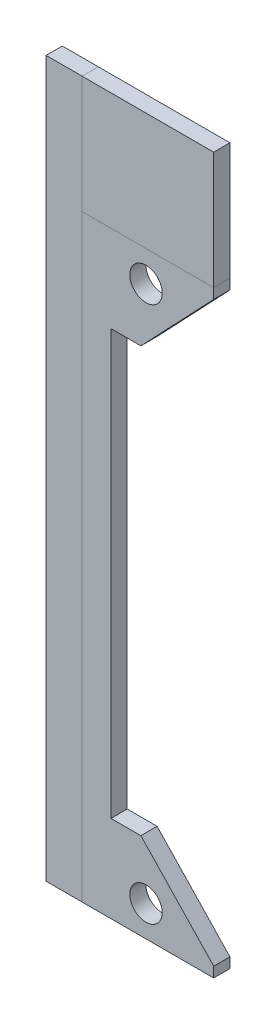
ISO-10303-21;
HEADER;
FILE_DESCRIPTION(('STEP AP214'),'2;1');
FILE_NAME('part.step','',(''),(''),'','','');
FILE_SCHEMA(('AUTOMOTIVE_DESIGN { 1 0 10303 214 1 1 1 1 }'));
ENDSEC;
DATA;
#1=APPLICATION_CONTEXT('core data for automotive mechanical design processes');
#2=APPLICATION_PROTOCOL_DEFINITION('international standard','automotive_design',2000,#1);
#3=PRODUCT_CONTEXT('',#1,'mechanical');
#4=PRODUCT('Part','Part','',(#3));
#5=PRODUCT_RELATED_PRODUCT_CATEGORY('part','',(#4));
#6=PRODUCT_DEFINITION_FORMATION('','',#4);
#7=PRODUCT_DEFINITION_CONTEXT('part definition',#1,'design');
#8=PRODUCT_DEFINITION('design','',#6,#7);
#9=PRODUCT_DEFINITION_SHAPE('','',#8);
#10=(LENGTH_UNIT() NAMED_UNIT(*) SI_UNIT(.MILLI.,.METRE.));
#11=(NAMED_UNIT(*) PLANE_ANGLE_UNIT() SI_UNIT($,.RADIAN.));
#12=(NAMED_UNIT(*) SI_UNIT($,.STERADIAN.) SOLID_ANGLE_UNIT());
#13=UNCERTAINTY_MEASURE_WITH_UNIT(LENGTH_MEASURE(1.E-05),#10,'distance_accuracy_value','');
#14=(GEOMETRIC_REPRESENTATION_CONTEXT(3) GLOBAL_UNCERTAINTY_ASSIGNED_CONTEXT((#13)) GLOBAL_UNIT_ASSIGNED_CONTEXT((#10,
#11,#12)) REPRESENTATION_CONTEXT('',''));
#15=CARTESIAN_POINT('',(0.,0.,0.));
#16=DIRECTION('',(0.,0.,1.));
#17=DIRECTION('',(1.,0.,0.));
#18=AXIS2_PLACEMENT_3D('',#15,#16,#17);
#19=CARTESIAN_POINT('',(0.,0.,3.17499999999991));
#20=DIRECTION('',(0.,0.,-1.));
#21=DIRECTION('',(-1.,0.,0.));
#22=AXIS2_PLACEMENT_3D('',#19,#20,#21);
#23=PLANE('',#22);
#24=DIRECTION('',(0.,1.,0.));
#25=VECTOR('',#24,1.);
#26=CARTESIAN_POINT('',(-490.,1.49999999999986,3.17499999999997));
#27=LINE('',#26,#25);
#28=CARTESIAN_POINT('',(-490.,1.49999999999986,3.17499999999997));
#29=VERTEX_POINT('',#28);
#30=CARTESIAN_POINT('',(-490.,141.459761952969,3.17499999999996));
#31=VERTEX_POINT('',#30);
#32=EDGE_CURVE('E243',#29,#31,#27,.T.);
#33=ORIENTED_EDGE('',*,*,#32,.T.);
#34=DIRECTION('',(-1.,0.,0.));
#35=VECTOR('',#34,1.);
#36=CARTESIAN_POINT('',(-490.,141.459761952969,3.17499999999996));
#37=LINE('',#36,#35);
#38=CARTESIAN_POINT('',(-497.05,141.459761952969,3.17499999999986));
#39=VERTEX_POINT('',#38);
#40=EDGE_CURVE('E249',#31,#39,#37,.T.);
#41=ORIENTED_EDGE('',*,*,#40,.T.);
#42=DIRECTION('',(0.,1.,0.));
#43=VECTOR('',#42,1.);
#44=CARTESIAN_POINT('',(-497.05,1.49999999999986,3.17499999999995));
#45=LINE('',#44,#43);
#46=CARTESIAN_POINT('',(-497.05,1.49999999999986,3.17499999999995));
#47=VERTEX_POINT('',#46);
#48=EDGE_CURVE('E273',#47,#39,#45,.T.);
#49=ORIENTED_EDGE('',*,*,#48,.F.);
#50=DIRECTION('',(-1.,0.,0.));
#51=VECTOR('',#50,1.);
#52=CARTESIAN_POINT('',(-490.,1.49999999999986,3.17499999999997));
#53=LINE('',#52,#51);
#54=EDGE_CURVE('E223',#29,#47,#53,.T.);
#55=ORIENTED_EDGE('',*,*,#54,.F.);
#56=EDGE_LOOP('',(#33,#41,#49,#55));
#57=FACE_BOUND('',#56,.T.);
#58=ADVANCED_FACE('F214',(#57),#23,.F.);
#59=CARTESIAN_POINT('',(0.,0.,0.));
#60=DIRECTION('',(0.,0.,-1.));
#61=DIRECTION('',(-1.,0.,0.));
#62=AXIS2_PLACEMENT_3D('',#59,#60,#61);
#63=PLANE('',#62);
#64=DIRECTION('',(0.,1.,0.));
#65=VECTOR('',#64,1.);
#66=CARTESIAN_POINT('',(-490.,1.49999999999986,0.));
#67=LINE('',#66,#65);
#68=CARTESIAN_POINT('',(-490.,1.49999999999986,0.));
#69=VERTEX_POINT('',#68);
#70=CARTESIAN_POINT('',(-490.,141.459761952969,0.));
#71=VERTEX_POINT('',#70);
#72=EDGE_CURVE('E231',#69,#71,#67,.T.);
#73=ORIENTED_EDGE('',*,*,#72,.F.);
#74=DIRECTION('',(-1.,0.,0.));
#75=VECTOR('',#74,1.);
#76=CARTESIAN_POINT('',(-490.,1.49999999999986,0.));
#77=LINE('',#76,#75);
#78=CARTESIAN_POINT('',(-497.05,1.49999999999986,0.));
#79=VERTEX_POINT('',#78);
#80=EDGE_CURVE('E13',#69,#79,#77,.T.);
#81=ORIENTED_EDGE('',*,*,#80,.T.);
#82=DIRECTION('',(0.,1.,0.));
#83=VECTOR('',#82,1.);
#84=CARTESIAN_POINT('',(-497.05,1.49999999999986,0.));
#85=LINE('',#84,#83);
#86=CARTESIAN_POINT('',(-497.05,141.459761952969,-1.42816611549368E-13));
#87=VERTEX_POINT('',#86);
#88=EDGE_CURVE('E258',#79,#87,#85,.T.);
#89=ORIENTED_EDGE('',*,*,#88,.T.);
#90=DIRECTION('',(-1.,0.,0.));
#91=VECTOR('',#90,1.);
#92=CARTESIAN_POINT('',(-490.,141.459761952969,0.));
#93=LINE('',#92,#91);
#94=EDGE_CURVE('E291',#71,#87,#93,.T.);
#95=ORIENTED_EDGE('',*,*,#94,.F.);
#96=EDGE_LOOP('',(#73,#81,#89,#95));
#97=FACE_BOUND('',#96,.T.);
#98=ADVANCED_FACE('F257',(#97),#63,.T.);
#99=CARTESIAN_POINT('',(-490.,1.49999999999986,0.));
#100=DIRECTION('',(1.,0.,0.));
#101=DIRECTION('',(0.,1.,0.));
#102=AXIS2_PLACEMENT_3D('',#99,#100,#101);
#103=PLANE('',#102);
#104=ORIENTED_EDGE('',*,*,#32,.F.);
#105=DIRECTION('',(0.,0.,1.));
#106=VECTOR('',#105,1.);
#107=CARTESIAN_POINT('',(-490.,1.49999999999986,0.));
#108=LINE('',#107,#106);
#109=EDGE_CURVE('E285',#69,#29,#108,.T.);
#110=ORIENTED_EDGE('',*,*,#109,.F.);
#111=ORIENTED_EDGE('',*,*,#72,.T.);
#112=DIRECTION('',(0.,0.,1.));
#113=VECTOR('',#112,1.);
#114=CARTESIAN_POINT('',(-490.,141.459761952969,0.));
#115=LINE('',#114,#113);
#116=EDGE_CURVE('E298',#71,#31,#115,.T.);
#117=ORIENTED_EDGE('',*,*,#116,.T.);
#118=EDGE_LOOP('',(#104,#110,#111,#117));
#119=FACE_BOUND('',#118,.T.);
#120=ADVANCED_FACE('F310',(#119),#103,.T.);
#121=CARTESIAN_POINT('',(-490.,141.459761952969,0.));
#122=DIRECTION('',(0.,1.,0.));
#123=DIRECTION('',(0.,0.,1.));
#124=AXIS2_PLACEMENT_3D('',#121,#122,#123);
#125=PLANE('',#124);
#126=ORIENTED_EDGE('',*,*,#40,.F.);
#127=ORIENTED_EDGE('',*,*,#116,.F.);
#128=ORIENTED_EDGE('',*,*,#94,.T.);
#129=DIRECTION('',(0.,0.,1.));
#130=VECTOR('',#129,1.);
#131=CARTESIAN_POINT('',(-497.05,141.459761952969,-1.42816611549368E-13));
#132=LINE('',#131,#130);
#133=EDGE_CURVE('E269',#87,#39,#132,.T.);
#134=ORIENTED_EDGE('',*,*,#133,.T.);
#135=EDGE_LOOP('',(#126,#127,#128,#134));
#136=FACE_BOUND('',#135,.T.);
#137=ADVANCED_FACE('F312',(#136),#125,.T.);
#138=CARTESIAN_POINT('',(-490.,1.49999999999986,0.));
#139=DIRECTION('',(0.,1.,0.));
#140=DIRECTION('',(0.,0.,1.));
#141=AXIS2_PLACEMENT_3D('',#138,#139,#140);
#142=PLANE('',#141);
#143=ORIENTED_EDGE('',*,*,#54,.T.);
#144=DIRECTION('',(0.,0.,1.));
#145=VECTOR('',#144,1.);
#146=CARTESIAN_POINT('',(-497.05,1.49999999999986,0.));
#147=LINE('',#146,#145);
#148=EDGE_CURVE('E267',#79,#47,#147,.T.);
#149=ORIENTED_EDGE('',*,*,#148,.F.);
#150=ORIENTED_EDGE('',*,*,#80,.F.);
#151=ORIENTED_EDGE('',*,*,#109,.T.);
#152=EDGE_LOOP('',(#143,#149,#150,#151));
#153=FACE_BOUND('',#152,.T.);
#154=ADVANCED_FACE('F272',(#153),#142,.F.);
#155=CARTESIAN_POINT('',(-497.05,1.49999999999986,0.));
#156=DIRECTION('',(1.,0.,0.));
#157=DIRECTION('',(0.,0.,-1.));
#158=AXIS2_PLACEMENT_3D('',#155,#156,#157);
#159=PLANE('',#158);
#160=ORIENTED_EDGE('',*,*,#48,.T.);
#161=ORIENTED_EDGE('',*,*,#133,.F.);
#162=ORIENTED_EDGE('',*,*,#88,.F.);
#163=ORIENTED_EDGE('',*,*,#148,.T.);
#164=EDGE_LOOP('',(#160,#161,#162,#163));
#165=FACE_BOUND('',#164,.T.);
#166=ADVANCED_FACE('F266',(#165),#159,.F.);
#167=CLOSED_SHELL('',(#58,#98,#120,#137,#154,#166));
#168=MANIFOLD_SOLID_BREP('B2',#167);
#169=CARTESIAN_POINT('',(0.,0.,3.17499999999997));
#170=DIRECTION('',(0.,0.,-1.));
#171=DIRECTION('',(-1.,0.,0.));
#172=AXIS2_PLACEMENT_3D('',#169,#170,#171);
#173=PLANE('',#172);
#174=DIRECTION('',(0.,1.,0.));
#175=VECTOR('',#174,1.);
#176=CARTESIAN_POINT('',(-490.,118.5,3.17499999999997));
#177=LINE('',#176,#175);
#178=CARTESIAN_POINT('',(-490.,118.5,3.17499999999997));
#179=VERTEX_POINT('',#178);
#180=CARTESIAN_POINT('',(-490.,141.459761952969,3.17499999999996));
#181=VERTEX_POINT('',#180);
#182=EDGE_CURVE('E410',#179,#181,#177,.T.);
#183=ORIENTED_EDGE('',*,*,#182,.F.);
#184=DIRECTION('',(1.,0.,0.));
#185=VECTOR('',#184,1.);
#186=CARTESIAN_POINT('',(-490.,118.5,3.17499999999997));
#187=LINE('',#186,#185);
#188=CARTESIAN_POINT('',(-464.25,118.5,3.17499999999997));
#189=VERTEX_POINT('',#188);
#190=EDGE_CURVE('E417',#179,#189,#187,.T.);
#191=ORIENTED_EDGE('',*,*,#190,.T.);
#192=DIRECTION('',(0.,1.,0.));
#193=VECTOR('',#192,1.);
#194=CARTESIAN_POINT('',(-464.25,118.5,3.17499999999997));
#195=LINE('',#194,#193);
#196=CARTESIAN_POINT('',(-464.25,141.459761952969,3.17499999999998));
#197=VERTEX_POINT('',#196);
#198=EDGE_CURVE('E442',#189,#197,#195,.T.);
#199=ORIENTED_EDGE('',*,*,#198,.T.);
#200=DIRECTION('',(1.,0.,0.));
#201=VECTOR('',#200,1.);
#202=CARTESIAN_POINT('',(-490.,141.459761952969,3.17499999999996));
#203=LINE('',#202,#201);
#204=EDGE_CURVE('E379',#181,#197,#203,.T.);
#205=ORIENTED_EDGE('',*,*,#204,.F.);
#206=EDGE_LOOP('',(#183,#191,#199,#205));
#207=FACE_BOUND('',#206,.T.);
#208=ADVANCED_FACE('F370',(#207),#173,.F.);
#209=CARTESIAN_POINT('',(0.,0.,0.));
#210=DIRECTION('',(0.,0.,-1.));
#211=DIRECTION('',(-1.,0.,0.));
#212=AXIS2_PLACEMENT_3D('',#209,#210,#211);
#213=PLANE('',#212);
#214=DIRECTION('',(0.,1.,0.));
#215=VECTOR('',#214,1.);
#216=CARTESIAN_POINT('',(-490.,118.5,0.));
#217=LINE('',#216,#215);
#218=CARTESIAN_POINT('',(-490.,118.5,0.));
#219=VERTEX_POINT('',#218);
#220=CARTESIAN_POINT('',(-490.,141.459761952969,0.));
#221=VERTEX_POINT('',#220);
#222=EDGE_CURVE('E429',#219,#221,#217,.T.);
#223=ORIENTED_EDGE('',*,*,#222,.T.);
#224=DIRECTION('',(1.,0.,0.));
#225=VECTOR('',#224,1.);
#226=CARTESIAN_POINT('',(-490.,141.459761952969,0.));
#227=LINE('',#226,#225);
#228=CARTESIAN_POINT('',(-464.25,141.459761952969,0.));
#229=VERTEX_POINT('',#228);
#230=EDGE_CURVE('E212',#221,#229,#227,.T.);
#231=ORIENTED_EDGE('',*,*,#230,.T.);
#232=DIRECTION('',(0.,1.,0.));
#233=VECTOR('',#232,1.);
#234=CARTESIAN_POINT('',(-464.25,118.5,0.));
#235=LINE('',#234,#233);
#236=CARTESIAN_POINT('',(-464.25,118.5,0.));
#237=VERTEX_POINT('',#236);
#238=EDGE_CURVE('E388',#237,#229,#235,.T.);
#239=ORIENTED_EDGE('',*,*,#238,.F.);
#240=DIRECTION('',(1.,0.,0.));
#241=VECTOR('',#240,1.);
#242=CARTESIAN_POINT('',(-490.,118.5,0.));
#243=LINE('',#242,#241);
#244=EDGE_CURVE('E424',#219,#237,#243,.T.);
#245=ORIENTED_EDGE('',*,*,#244,.F.);
#246=EDGE_LOOP('',(#223,#231,#239,#245));
#247=FACE_BOUND('',#246,.T.);
#248=ADVANCED_FACE('F454',(#247),#213,.T.);
#249=CARTESIAN_POINT('',(-490.,118.5,0.));
#250=DIRECTION('',(1.,0.,0.));
#251=DIRECTION('',(0.,0.,-1.));
#252=AXIS2_PLACEMENT_3D('',#249,#250,#251);
#253=PLANE('',#252);
#254=ORIENTED_EDGE('',*,*,#182,.T.);
#255=DIRECTION('',(0.,0.,1.));
#256=VECTOR('',#255,1.);
#257=CARTESIAN_POINT('',(-490.,141.459761952969,0.));
#258=LINE('',#257,#256);
#259=EDGE_CURVE('E425',#221,#181,#258,.T.);
#260=ORIENTED_EDGE('',*,*,#259,.F.);
#261=ORIENTED_EDGE('',*,*,#222,.F.);
#262=DIRECTION('',(0.,0.,1.));
#263=VECTOR('',#262,1.);
#264=CARTESIAN_POINT('',(-490.,118.5,0.));
#265=LINE('',#264,#263);
#266=EDGE_CURVE('E419',#219,#179,#265,.T.);
#267=ORIENTED_EDGE('',*,*,#266,.T.);
#268=EDGE_LOOP('',(#254,#260,#261,#267));
#269=FACE_BOUND('',#268,.T.);
#270=ADVANCED_FACE('F427',(#269),#253,.F.);
#271=CARTESIAN_POINT('',(-490.,141.459761952969,0.));
#272=DIRECTION('',(0.,-1.,0.));
#273=DIRECTION('',(0.,0.,-1.));
#274=AXIS2_PLACEMENT_3D('',#271,#272,#273);
#275=PLANE('',#274);
#276=ORIENTED_EDGE('',*,*,#204,.T.);
#277=DIRECTION('',(0.,0.,1.));
#278=VECTOR('',#277,1.);
#279=CARTESIAN_POINT('',(-464.25,141.459761952969,0.));
#280=LINE('',#279,#278);
#281=EDGE_CURVE('E439',#229,#197,#280,.T.);
#282=ORIENTED_EDGE('',*,*,#281,.F.);
#283=ORIENTED_EDGE('',*,*,#230,.F.);
#284=ORIENTED_EDGE('',*,*,#259,.T.);
#285=EDGE_LOOP('',(#276,#282,#283,#284));
#286=FACE_BOUND('',#285,.T.);
#287=ADVANCED_FACE('F468',(#286),#275,.F.);
#288=CARTESIAN_POINT('',(-490.,118.5,0.));
#289=DIRECTION('',(0.,-1.,0.));
#290=DIRECTION('',(1.,0.,0.));
#291=AXIS2_PLACEMENT_3D('',#288,#289,#290);
#292=PLANE('',#291);
#293=ORIENTED_EDGE('',*,*,#190,.F.);
#294=ORIENTED_EDGE('',*,*,#266,.F.);
#295=ORIENTED_EDGE('',*,*,#244,.T.);
#296=DIRECTION('',(0.,0.,1.));
#297=VECTOR('',#296,1.);
#298=CARTESIAN_POINT('',(-464.25,118.5,0.));
#299=LINE('',#298,#297);
#300=EDGE_CURVE('E421',#237,#189,#299,.T.);
#301=ORIENTED_EDGE('',*,*,#300,.T.);
#302=EDGE_LOOP('',(#293,#294,#295,#301));
#303=FACE_BOUND('',#302,.T.);
#304=ADVANCED_FACE('F418',(#303),#292,.T.);
#305=CARTESIAN_POINT('',(-464.25,118.5,0.));
#306=DIRECTION('',(1.,0.,0.));
#307=DIRECTION('',(0.,0.,-1.));
#308=AXIS2_PLACEMENT_3D('',#305,#306,#307);
#309=PLANE('',#308);
#310=ORIENTED_EDGE('',*,*,#198,.F.);
#311=ORIENTED_EDGE('',*,*,#300,.F.);
#312=ORIENTED_EDGE('',*,*,#238,.T.);
#313=ORIENTED_EDGE('',*,*,#281,.T.);
#314=EDGE_LOOP('',(#310,#311,#312,#313));
#315=FACE_BOUND('',#314,.T.);
#316=ADVANCED_FACE('F456',(#315),#309,.T.);
#317=CLOSED_SHELL('',(#208,#248,#270,#287,#304,#316));
#318=MANIFOLD_SOLID_BREP('B7',#317);
#319=CARTESIAN_POINT('',(0.,0.,3.17499999999997));
#320=DIRECTION('',(0.,0.,-1.));
#321=DIRECTION('',(-1.,0.,0.));
#322=AXIS2_PLACEMENT_3D('',#319,#320,#321);
#323=PLANE('',#322);
#324=CARTESIAN_POINT('',(-477.5,7.49999999999986,3.17499999999997));
#325=DIRECTION('',(0.,0.,1.));
#326=DIRECTION('',(1.,0.,0.));
#327=AXIS2_PLACEMENT_3D('',#324,#325,#326);
#328=CIRCLE('',#327,3.17499999999997);
#329=CARTESIAN_POINT('',(-474.325,7.49999999999986,3.17499999999997));
#330=VERTEX_POINT('',#329);
#331=EDGE_CURVE('E745',#330,#330,#328,.T.);
#332=ORIENTED_EDGE('',*,*,#331,.F.);
#333=EDGE_LOOP('',(#332));
#334=FACE_BOUND('',#333,.T.);
#335=CARTESIAN_POINT('',(-477.5,112.5,3.17499999999997));
#336=DIRECTION('',(0.,0.,1.));
#337=DIRECTION('',(1.,0.,0.));
#338=AXIS2_PLACEMENT_3D('',#335,#336,#337);
#339=CIRCLE('',#338,3.17499999999997);
#340=CARTESIAN_POINT('',(-474.325,112.5,3.17499999999997));
#341=VERTEX_POINT('',#340);
#342=EDGE_CURVE('E723',#341,#341,#339,.T.);
#343=ORIENTED_EDGE('',*,*,#342,.F.);
#344=EDGE_LOOP('',(#343));
#345=FACE_BOUND('',#344,.T.);
#346=DIRECTION('',(0.688749461914693,0.724999433594414,0.));
#347=VECTOR('',#346,1.);
#348=CARTESIAN_POINT('',(-478.5,101.5,3.17499999999997));
#349=LINE('',#348,#347);
#350=CARTESIAN_POINT('',(-478.5,101.5,3.17499999999997));
#351=VERTEX_POINT('',#350);
#352=CARTESIAN_POINT('',(-464.25,116.5,3.17499999999997));
#353=VERTEX_POINT('',#352);
#354=EDGE_CURVE('E526',#351,#353,#349,.T.);
#355=ORIENTED_EDGE('',*,*,#354,.T.);
#356=DIRECTION('',(0.,1.,0.));
#357=VECTOR('',#356,1.);
#358=CARTESIAN_POINT('',(-464.25,116.5,3.17499999999997));
#359=LINE('',#358,#357);
#360=CARTESIAN_POINT('',(-464.25,118.5,3.17499999999999));
#361=VERTEX_POINT('',#360);
#362=EDGE_CURVE('E611',#353,#361,#359,.T.);
#363=ORIENTED_EDGE('',*,*,#362,.T.);
#364=DIRECTION('',(-1.,0.,0.));
#365=VECTOR('',#364,1.);
#366=CARTESIAN_POINT('',(-464.25,118.5,3.17499999999999));
#367=LINE('',#366,#365);
#368=CARTESIAN_POINT('',(-490.,118.5,3.17499999999997));
#369=VERTEX_POINT('',#368);
#370=EDGE_CURVE('E636',#361,#369,#367,.T.);
#371=ORIENTED_EDGE('',*,*,#370,.T.);
#372=DIRECTION('',(0.,-1.,0.));
#373=VECTOR('',#372,1.);
#374=CARTESIAN_POINT('',(-490.,118.5,3.17499999999997));
#375=LINE('',#374,#373);
#376=CARTESIAN_POINT('',(-490.,1.49999999999987,3.17499999999997));
#377=VERTEX_POINT('',#376);
#378=EDGE_CURVE('E648',#369,#377,#375,.T.);
#379=ORIENTED_EDGE('',*,*,#378,.T.);
#380=DIRECTION('',(1.,0.,0.));
#381=VECTOR('',#380,1.);
#382=CARTESIAN_POINT('',(-490.,1.49999999999986,3.17499999999997));
#383=LINE('',#382,#381);
#384=CARTESIAN_POINT('',(-464.25,1.49999999999986,3.17499999999997));
#385=VERTEX_POINT('',#384);
#386=EDGE_CURVE('E662',#377,#385,#383,.T.);
#387=ORIENTED_EDGE('',*,*,#386,.T.);
#388=DIRECTION('',(0.,-1.,0.));
#389=VECTOR('',#388,1.);
#390=CARTESIAN_POINT('',(-464.25,3.49999999999986,3.17499999999997));
#391=LINE('',#390,#389);
#392=CARTESIAN_POINT('',(-464.25,3.49999999999986,3.17499999999997));
#393=VERTEX_POINT('',#392);
#394=EDGE_CURVE('E675',#393,#385,#391,.T.);
#395=ORIENTED_EDGE('',*,*,#394,.F.);
#396=DIRECTION('',(-0.688749461914693,0.724999433594414,0.));
#397=VECTOR('',#396,1.);
#398=CARTESIAN_POINT('',(-464.25,3.49999999999986,3.17499999999997));
#399=LINE('',#398,#397);
#400=CARTESIAN_POINT('',(-478.5,18.4999999999999,3.17499999999997));
#401=VERTEX_POINT('',#400);
#402=EDGE_CURVE('E564',#393,#401,#399,.T.);
#403=ORIENTED_EDGE('',*,*,#402,.T.);
#404=DIRECTION('',(-1.,0.,0.));
#405=VECTOR('',#404,1.);
#406=CARTESIAN_POINT('',(-478.5,18.4999999999999,3.17499999999997));
#407=LINE('',#406,#405);
#408=CARTESIAN_POINT('',(-484.35,18.4999999999999,3.17499999999997));
#409=VERTEX_POINT('',#408);
#410=EDGE_CURVE('E558',#401,#409,#407,.T.);
#411=ORIENTED_EDGE('',*,*,#410,.T.);
#412=DIRECTION('',(0.,1.,0.));
#413=VECTOR('',#412,1.);
#414=CARTESIAN_POINT('',(-484.35,18.4999999999999,3.17499999999997));
#415=LINE('',#414,#413);
#416=CARTESIAN_POINT('',(-484.35,101.5,3.17499999999997));
#417=VERTEX_POINT('',#416);
#418=EDGE_CURVE('E553',#409,#417,#415,.T.);
#419=ORIENTED_EDGE('',*,*,#418,.T.);
#420=DIRECTION('',(1.,0.,0.));
#421=VECTOR('',#420,1.);
#422=CARTESIAN_POINT('',(-484.35,101.5,3.17499999999997));
#423=LINE('',#422,#421);
#424=EDGE_CURVE('E547',#417,#351,#423,.T.);
#425=ORIENTED_EDGE('',*,*,#424,.T.);
#426=EDGE_LOOP('',(#355,#363,#371,#379,#387,#395,#403,#411,#419,#425));
#427=FACE_BOUND('',#426,.T.);
#428=ADVANCED_FACE('F517',(#334,#345,#427),#323,.F.);
#429=CARTESIAN_POINT('',(0.,0.,0.));
#430=DIRECTION('',(0.,0.,-1.));
#431=DIRECTION('',(-1.,0.,0.));
#432=AXIS2_PLACEMENT_3D('',#429,#430,#431);
#433=PLANE('',#432);
#434=CARTESIAN_POINT('',(-477.5,7.49999999999986,0.));
#435=DIRECTION('',(0.,0.,1.));
#436=DIRECTION('',(1.,0.,0.));
#437=AXIS2_PLACEMENT_3D('',#434,#435,#436);
#438=CIRCLE('',#437,3.17499999999997);
#439=CARTESIAN_POINT('',(-474.325,7.49999999999986,0.));
#440=VERTEX_POINT('',#439);
#441=EDGE_CURVE('E748',#440,#440,#438,.T.);
#442=ORIENTED_EDGE('',*,*,#441,.T.);
#443=EDGE_LOOP('',(#442));
#444=FACE_BOUND('',#443,.T.);
#445=CARTESIAN_POINT('',(-477.5,112.5,0.));
#446=DIRECTION('',(0.,0.,1.));
#447=DIRECTION('',(1.,0.,0.));
#448=AXIS2_PLACEMENT_3D('',#445,#446,#447);
#449=CIRCLE('',#448,3.17499999999997);
#450=CARTESIAN_POINT('',(-474.325,112.5,0.));
#451=VERTEX_POINT('',#450);
#452=EDGE_CURVE('E726',#451,#451,#449,.T.);
#453=ORIENTED_EDGE('',*,*,#452,.T.);
#454=EDGE_LOOP('',(#453));
#455=FACE_BOUND('',#454,.T.);
#456=DIRECTION('',(0.688749461914693,0.724999433594414,0.));
#457=VECTOR('',#456,1.);
#458=CARTESIAN_POINT('',(-478.5,101.5,0.));
#459=LINE('',#458,#457);
#460=CARTESIAN_POINT('',(-478.5,101.5,0.));
#461=VERTEX_POINT('',#460);
#462=CARTESIAN_POINT('',(-464.25,116.5,0.));
#463=VERTEX_POINT('',#462);
#464=EDGE_CURVE('E368',#461,#463,#459,.T.);
#465=ORIENTED_EDGE('',*,*,#464,.F.);
#466=DIRECTION('',(1.,0.,0.));
#467=VECTOR('',#466,1.);
#468=CARTESIAN_POINT('',(-484.35,101.5,0.));
#469=LINE('',#468,#467);
#470=CARTESIAN_POINT('',(-484.35,101.5,0.));
#471=VERTEX_POINT('',#470);
#472=EDGE_CURVE('E718',#471,#461,#469,.T.);
#473=ORIENTED_EDGE('',*,*,#472,.F.);
#474=DIRECTION('',(0.,1.,0.));
#475=VECTOR('',#474,1.);
#476=CARTESIAN_POINT('',(-484.35,18.4999999999999,0.));
#477=LINE('',#476,#475);
#478=CARTESIAN_POINT('',(-484.35,18.4999999999999,0.));
#479=VERTEX_POINT('',#478);
#480=EDGE_CURVE('E573',#479,#471,#477,.T.);
#481=ORIENTED_EDGE('',*,*,#480,.F.);
#482=DIRECTION('',(-1.,0.,0.));
#483=VECTOR('',#482,1.);
#484=CARTESIAN_POINT('',(-478.5,18.4999999999999,0.));
#485=LINE('',#484,#483);
#486=CARTESIAN_POINT('',(-478.5,18.4999999999999,0.));
#487=VERTEX_POINT('',#486);
#488=EDGE_CURVE('E578',#487,#479,#485,.T.);
#489=ORIENTED_EDGE('',*,*,#488,.F.);
#490=DIRECTION('',(-0.688749461914693,0.724999433594414,0.));
#491=VECTOR('',#490,1.);
#492=CARTESIAN_POINT('',(-464.25,3.49999999999986,0.));
#493=LINE('',#492,#491);
#494=CARTESIAN_POINT('',(-464.25,3.49999999999986,0.));
#495=VERTEX_POINT('',#494);
#496=EDGE_CURVE('E584',#495,#487,#493,.T.);
#497=ORIENTED_EDGE('',*,*,#496,.F.);
#498=DIRECTION('',(0.,-1.,0.));
#499=VECTOR('',#498,1.);
#500=CARTESIAN_POINT('',(-464.25,3.49999999999986,0.));
#501=LINE('',#500,#499);
#502=CARTESIAN_POINT('',(-464.25,1.49999999999986,0.));
#503=VERTEX_POINT('',#502);
#504=EDGE_CURVE('E673',#495,#503,#501,.T.);
#505=ORIENTED_EDGE('',*,*,#504,.T.);
#506=DIRECTION('',(1.,0.,0.));
#507=VECTOR('',#506,1.);
#508=CARTESIAN_POINT('',(-490.,1.49999999999986,0.));
#509=LINE('',#508,#507);
#510=CARTESIAN_POINT('',(-490.,1.49999999999987,0.));
#511=VERTEX_POINT('',#510);
#512=EDGE_CURVE('E656',#511,#503,#509,.T.);
#513=ORIENTED_EDGE('',*,*,#512,.F.);
#514=DIRECTION('',(0.,-1.,0.));
#515=VECTOR('',#514,1.);
#516=CARTESIAN_POINT('',(-490.,118.5,0.));
#517=LINE('',#516,#515);
#518=CARTESIAN_POINT('',(-490.,118.5,0.));
#519=VERTEX_POINT('',#518);
#520=EDGE_CURVE('E642',#519,#511,#517,.T.);
#521=ORIENTED_EDGE('',*,*,#520,.F.);
#522=DIRECTION('',(-1.,0.,0.));
#523=VECTOR('',#522,1.);
#524=CARTESIAN_POINT('',(-464.25,118.5,0.));
#525=LINE('',#524,#523);
#526=CARTESIAN_POINT('',(-464.25,118.5,0.));
#527=VERTEX_POINT('',#526);
#528=EDGE_CURVE('E626',#527,#519,#525,.T.);
#529=ORIENTED_EDGE('',*,*,#528,.F.);
#530=DIRECTION('',(0.,1.,0.));
#531=VECTOR('',#530,1.);
#532=CARTESIAN_POINT('',(-464.25,116.5,0.));
#533=LINE('',#532,#531);
#534=EDGE_CURVE('E614',#463,#527,#533,.T.);
#535=ORIENTED_EDGE('',*,*,#534,.F.);
#536=EDGE_LOOP('',(#465,#473,#481,#489,#497,#505,#513,#521,#529,#535));
#537=FACE_BOUND('',#536,.T.);
#538=ADVANCED_FACE('F752',(#444,#455,#537),#433,.T.);
#539=CARTESIAN_POINT('',(-484.35,101.5,0.));
#540=DIRECTION('',(0.,-1.,0.));
#541=DIRECTION('',(0.,0.,-1.));
#542=AXIS2_PLACEMENT_3D('',#539,#540,#541);
#543=PLANE('',#542);
#544=ORIENTED_EDGE('',*,*,#424,.F.);
#545=DIRECTION('',(0.,0.,1.));
#546=VECTOR('',#545,1.);
#547=CARTESIAN_POINT('',(-484.35,101.5,0.));
#548=LINE('',#547,#546);
#549=EDGE_CURVE('E717',#471,#417,#548,.T.);
#550=ORIENTED_EDGE('',*,*,#549,.F.);
#551=ORIENTED_EDGE('',*,*,#472,.T.);
#552=DIRECTION('',(0.,0.,1.));
#553=VECTOR('',#552,1.);
#554=CARTESIAN_POINT('',(-478.5,101.5,0.));
#555=LINE('',#554,#553);
#556=EDGE_CURVE('E715',#461,#351,#555,.T.);
#557=ORIENTED_EDGE('',*,*,#556,.T.);
#558=EDGE_LOOP('',(#544,#550,#551,#557));
#559=FACE_BOUND('',#558,.T.);
#560=ADVANCED_FACE('F777',(#559),#543,.T.);
#561=CARTESIAN_POINT('',(-484.35,18.4999999999999,0.));
#562=DIRECTION('',(1.,0.,0.));
#563=DIRECTION('',(0.,1.,0.));
#564=AXIS2_PLACEMENT_3D('',#561,#562,#563);
#565=PLANE('',#564);
#566=ORIENTED_EDGE('',*,*,#418,.F.);
#567=DIRECTION('',(0.,0.,1.));
#568=VECTOR('',#567,1.);
#569=CARTESIAN_POINT('',(-484.35,18.4999999999999,0.));
#570=LINE('',#569,#568);
#571=EDGE_CURVE('E707',#479,#409,#570,.T.);
#572=ORIENTED_EDGE('',*,*,#571,.F.);
#573=ORIENTED_EDGE('',*,*,#480,.T.);
#574=ORIENTED_EDGE('',*,*,#549,.T.);
#575=EDGE_LOOP('',(#566,#572,#573,#574));
#576=FACE_BOUND('',#575,.T.);
#577=ADVANCED_FACE('F780',(#576),#565,.T.);
#578=CARTESIAN_POINT('',(-478.5,18.4999999999999,0.));
#579=DIRECTION('',(0.,1.,0.));
#580=DIRECTION('',(-1.,0.,0.));
#581=AXIS2_PLACEMENT_3D('',#578,#579,#580);
#582=PLANE('',#581);
#583=ORIENTED_EDGE('',*,*,#410,.F.);
#584=DIRECTION('',(0.,0.,1.));
#585=VECTOR('',#584,1.);
#586=CARTESIAN_POINT('',(-478.5,18.4999999999999,0.));
#587=LINE('',#586,#585);
#588=EDGE_CURVE('E697',#487,#401,#587,.T.);
#589=ORIENTED_EDGE('',*,*,#588,.F.);
#590=ORIENTED_EDGE('',*,*,#488,.T.);
#591=ORIENTED_EDGE('',*,*,#571,.T.);
#592=EDGE_LOOP('',(#583,#589,#590,#591));
#593=FACE_BOUND('',#592,.T.);
#594=ADVANCED_FACE('F784',(#593),#582,.T.);
#595=CARTESIAN_POINT('',(-464.25,3.49999999999986,0.));
#596=DIRECTION('',(0.724999433594414,0.688749461914693,0.));
#597=DIRECTION('',(-0.688749461914693,0.724999433594414,0.));
#598=AXIS2_PLACEMENT_3D('',#595,#596,#597);
#599=PLANE('',#598);
#600=ORIENTED_EDGE('',*,*,#402,.F.);
#601=DIRECTION('',(0.,0.,1.));
#602=VECTOR('',#601,1.);
#603=CARTESIAN_POINT('',(-464.25,3.49999999999986,0.));
#604=LINE('',#603,#602);
#605=EDGE_CURVE('E686',#495,#393,#604,.T.);
#606=ORIENTED_EDGE('',*,*,#605,.F.);
#607=ORIENTED_EDGE('',*,*,#496,.T.);
#608=ORIENTED_EDGE('',*,*,#588,.T.);
#609=EDGE_LOOP('',(#600,#606,#607,#608));
#610=FACE_BOUND('',#609,.T.);
#611=ADVANCED_FACE('F787',(#610),#599,.T.);
#612=CARTESIAN_POINT('',(-490.,1.49999999999986,0.));
#613=DIRECTION('',(0.,-1.,0.));
#614=DIRECTION('',(1.,0.,0.));
#615=AXIS2_PLACEMENT_3D('',#612,#613,#614);
#616=PLANE('',#615);
#617=ORIENTED_EDGE('',*,*,#386,.F.);
#618=DIRECTION('',(0.,0.,1.));
#619=VECTOR('',#618,1.);
#620=CARTESIAN_POINT('',(-490.,1.49999999999986,0.));
#621=LINE('',#620,#619);
#622=EDGE_CURVE('E659',#511,#377,#621,.T.);
#623=ORIENTED_EDGE('',*,*,#622,.F.);
#624=ORIENTED_EDGE('',*,*,#512,.T.);
#625=DIRECTION('',(0.,0.,1.));
#626=VECTOR('',#625,1.);
#627=CARTESIAN_POINT('',(-464.25,1.49999999999986,0.));
#628=LINE('',#627,#626);
#629=EDGE_CURVE('E670',#503,#385,#628,.T.);
#630=ORIENTED_EDGE('',*,*,#629,.T.);
#631=EDGE_LOOP('',(#617,#623,#624,#630));
#632=FACE_BOUND('',#631,.T.);
#633=ADVANCED_FACE('F790',(#632),#616,.T.);
#634=CARTESIAN_POINT('',(-490.,118.5,0.));
#635=DIRECTION('',(-1.,0.,0.));
#636=DIRECTION('',(0.,-1.,0.));
#637=AXIS2_PLACEMENT_3D('',#634,#635,#636);
#638=PLANE('',#637);
#639=ORIENTED_EDGE('',*,*,#378,.F.);
#640=DIRECTION('',(0.,0.,1.));
#641=VECTOR('',#640,1.);
#642=CARTESIAN_POINT('',(-490.,118.5,0.));
#643=LINE('',#642,#641);
#644=EDGE_CURVE('E645',#519,#369,#643,.T.);
#645=ORIENTED_EDGE('',*,*,#644,.F.);
#646=ORIENTED_EDGE('',*,*,#520,.T.);
#647=ORIENTED_EDGE('',*,*,#622,.T.);
#648=EDGE_LOOP('',(#639,#645,#646,#647));
#649=FACE_BOUND('',#648,.T.);
#650=ADVANCED_FACE('F795',(#649),#638,.T.);
#651=CARTESIAN_POINT('',(-464.25,118.5,0.));
#652=DIRECTION('',(0.,1.,0.));
#653=DIRECTION('',(-1.,0.,0.));
#654=AXIS2_PLACEMENT_3D('',#651,#652,#653);
#655=PLANE('',#654);
#656=ORIENTED_EDGE('',*,*,#370,.F.);
#657=DIRECTION('',(0.,0.,1.));
#658=VECTOR('',#657,1.);
#659=CARTESIAN_POINT('',(-464.25,118.5,0.));
#660=LINE('',#659,#658);
#661=EDGE_CURVE('E624',#527,#361,#660,.T.);
#662=ORIENTED_EDGE('',*,*,#661,.F.);
#663=ORIENTED_EDGE('',*,*,#528,.T.);
#664=ORIENTED_EDGE('',*,*,#644,.T.);
#665=EDGE_LOOP('',(#656,#662,#663,#664));
#666=FACE_BOUND('',#665,.T.);
#667=ADVANCED_FACE('F799',(#666),#655,.T.);
#668=CARTESIAN_POINT('',(-464.25,116.5,0.));
#669=DIRECTION('',(1.,0.,0.));
#670=DIRECTION('',(0.,0.,-1.));
#671=AXIS2_PLACEMENT_3D('',#668,#669,#670);
#672=PLANE('',#671);
#673=ORIENTED_EDGE('',*,*,#362,.F.);
#674=DIRECTION('',(0.,0.,1.));
#675=VECTOR('',#674,1.);
#676=CARTESIAN_POINT('',(-464.25,116.5,0.));
#677=LINE('',#676,#675);
#678=EDGE_CURVE('E617',#463,#353,#677,.T.);
#679=ORIENTED_EDGE('',*,*,#678,.F.);
#680=ORIENTED_EDGE('',*,*,#534,.T.);
#681=ORIENTED_EDGE('',*,*,#661,.T.);
#682=EDGE_LOOP('',(#673,#679,#680,#681));
#683=FACE_BOUND('',#682,.T.);
#684=ADVANCED_FACE('F622',(#683),#672,.T.);
#685=CARTESIAN_POINT('',(-478.5,101.5,0.));
#686=DIRECTION('',(0.724999433594414,-0.688749461914693,0.));
#687=DIRECTION('',(0.688749461914693,0.724999433594414,0.));
#688=AXIS2_PLACEMENT_3D('',#685,#686,#687);
#689=PLANE('',#688);
#690=ORIENTED_EDGE('',*,*,#354,.F.);
#691=ORIENTED_EDGE('',*,*,#556,.F.);
#692=ORIENTED_EDGE('',*,*,#464,.T.);
#693=ORIENTED_EDGE('',*,*,#678,.T.);
#694=EDGE_LOOP('',(#690,#691,#692,#693));
#695=FACE_BOUND('',#694,.T.);
#696=ADVANCED_FACE('F618',(#695),#689,.T.);
#697=CARTESIAN_POINT('',(-464.25,3.49999999999986,0.));
#698=DIRECTION('',(-1.,0.,0.));
#699=DIRECTION('',(0.,0.,1.));
#700=AXIS2_PLACEMENT_3D('',#697,#698,#699);
#701=PLANE('',#700);
#702=ORIENTED_EDGE('',*,*,#394,.T.);
#703=ORIENTED_EDGE('',*,*,#629,.F.);
#704=ORIENTED_EDGE('',*,*,#504,.F.);
#705=ORIENTED_EDGE('',*,*,#605,.T.);
#706=EDGE_LOOP('',(#702,#703,#704,#705));
#707=FACE_BOUND('',#706,.T.);
#708=ADVANCED_FACE('F767',(#707),#701,.F.);
#709=CARTESIAN_POINT('',(-477.5,112.5,0.));
#710=DIRECTION('',(0.,0.,1.));
#711=DIRECTION('',(1.,0.,0.));
#712=AXIS2_PLACEMENT_3D('',#709,#710,#711);
#713=CYLINDRICAL_SURFACE('',#712,3.17499999999997);
#714=ORIENTED_EDGE('',*,*,#452,.F.);
#715=EDGE_LOOP('',(#714));
#716=FACE_BOUND('',#715,.T.);
#717=ORIENTED_EDGE('',*,*,#342,.T.);
#718=EDGE_LOOP('',(#717));
#719=FACE_BOUND('',#718,.T.);
#720=ADVANCED_FACE('F758',(#716,#719),#713,.F.);
#721=CARTESIAN_POINT('',(-477.5,7.49999999999986,0.));
#722=DIRECTION('',(0.,0.,1.));
#723=DIRECTION('',(1.,0.,0.));
#724=AXIS2_PLACEMENT_3D('',#721,#722,#723);
#725=CYLINDRICAL_SURFACE('',#724,3.17499999999997);
#726=ORIENTED_EDGE('',*,*,#441,.F.);
#727=EDGE_LOOP('',(#726));
#728=FACE_BOUND('',#727,.T.);
#729=ORIENTED_EDGE('',*,*,#331,.T.);
#730=EDGE_LOOP('',(#729));
#731=FACE_BOUND('',#730,.T.);
#732=ADVANCED_FACE('F755',(#728,#731),#725,.F.);
#733=CLOSED_SHELL('',(#428,#538,#560,#577,#594,#611,#633,#650,#667,#684,#696,#708,#720,#732));
#734=MANIFOLD_SOLID_BREP('B206',#733);
#735=ADVANCED_BREP_SHAPE_REPRESENTATION('',(#18,#168,#318,#734),#14);
#736=SHAPE_DEFINITION_REPRESENTATION(#9,#735);
ENDSEC;
END-ISO-10303-21;
